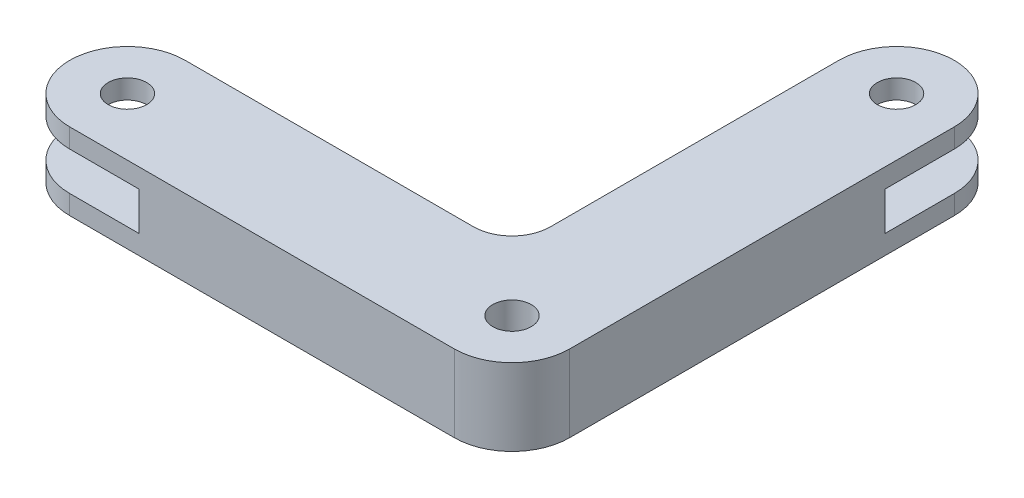
ISO-10303-21;
HEADER;
FILE_DESCRIPTION(('STEP AP214'),'2;1');
FILE_NAME('part.step','',(''),(''),'','','');
FILE_SCHEMA(('AUTOMOTIVE_DESIGN { 1 0 10303 214 1 1 1 1 }'));
ENDSEC;
DATA;
#1=APPLICATION_CONTEXT('core data for automotive mechanical design processes');
#2=APPLICATION_PROTOCOL_DEFINITION('international standard','automotive_design',2000,#1);
#3=PRODUCT_CONTEXT('',#1,'mechanical');
#4=PRODUCT('Part','Part','',(#3));
#5=PRODUCT_RELATED_PRODUCT_CATEGORY('part','',(#4));
#6=PRODUCT_DEFINITION_FORMATION('','',#4);
#7=PRODUCT_DEFINITION_CONTEXT('part definition',#1,'design');
#8=PRODUCT_DEFINITION('design','',#6,#7);
#9=PRODUCT_DEFINITION_SHAPE('','',#8);
#10=(LENGTH_UNIT() NAMED_UNIT(*) SI_UNIT(.MILLI.,.METRE.));
#11=(NAMED_UNIT(*) PLANE_ANGLE_UNIT() SI_UNIT($,.RADIAN.));
#12=(NAMED_UNIT(*) SI_UNIT($,.STERADIAN.) SOLID_ANGLE_UNIT());
#13=UNCERTAINTY_MEASURE_WITH_UNIT(LENGTH_MEASURE(1.E-05),#10,'distance_accuracy_value','');
#14=(GEOMETRIC_REPRESENTATION_CONTEXT(3) GLOBAL_UNCERTAINTY_ASSIGNED_CONTEXT((#13)) GLOBAL_UNIT_ASSIGNED_CONTEXT((#10,
#11,#12)) REPRESENTATION_CONTEXT('',''));
#15=CARTESIAN_POINT('',(0.,0.,0.));
#16=DIRECTION('',(0.,0.,1.));
#17=DIRECTION('',(1.,0.,0.));
#18=AXIS2_PLACEMENT_3D('',#15,#16,#17);
#19=CARTESIAN_POINT('',(-2.44892974052389,9.,-42.4489297405239));
#20=DIRECTION('',(0.,-1.,0.));
#21=DIRECTION('',(0.,0.,-1.));
#22=AXIS2_PLACEMENT_3D('',#19,#20,#21);
#23=CYLINDRICAL_SURFACE('',#22,6.);
#24=CARTESIAN_POINT('',(-2.44892974052389,3.,-42.4489297405239));
#25=DIRECTION('',(0.,1.,0.));
#26=DIRECTION('',(0.,0.,1.));
#27=AXIS2_PLACEMENT_3D('',#24,#25,#26);
#28=CIRCLE('',#27,6.);
#29=CARTESIAN_POINT('',(3.55107025947611,3.,-42.4489297405239));
#30=VERTEX_POINT('',#29);
#31=CARTESIAN_POINT('',(-8.44892974052389,3.,-42.4489297405239));
#32=VERTEX_POINT('',#31);
#33=EDGE_CURVE('E60',#30,#32,#28,.T.);
#34=ORIENTED_EDGE('',*,*,#33,.F.);
#35=DIRECTION('',(0.,-1.,0.));
#36=VECTOR('',#35,1.);
#37=CARTESIAN_POINT('',(3.55107025947611,9.,-42.4489297405239));
#38=LINE('',#37,#36);
#39=CARTESIAN_POINT('',(3.55107025947611,1.,-42.4489297405239));
#40=VERTEX_POINT('',#39);
#41=EDGE_CURVE('E289',#30,#40,#38,.T.);
#42=ORIENTED_EDGE('',*,*,#41,.T.);
#43=CARTESIAN_POINT('',(-2.44892974052389,1.,-42.4489297405239));
#44=DIRECTION('',(0.,1.,0.));
#45=DIRECTION('',(0.,0.,1.));
#46=AXIS2_PLACEMENT_3D('',#43,#44,#45);
#47=CIRCLE('',#46,6.);
#48=CARTESIAN_POINT('',(-8.44892974052389,1.,-42.4489297405239));
#49=VERTEX_POINT('',#48);
#50=EDGE_CURVE('E260',#40,#49,#47,.T.);
#51=ORIENTED_EDGE('',*,*,#50,.T.);
#52=DIRECTION('',(0.,-1.,0.));
#53=VECTOR('',#52,1.);
#54=CARTESIAN_POINT('',(-8.44892974052389,9.,-42.4489297405239));
#55=LINE('',#54,#53);
#56=EDGE_CURVE('E285',#32,#49,#55,.T.);
#57=ORIENTED_EDGE('',*,*,#56,.F.);
#58=EDGE_LOOP('',(#34,#42,#51,#57));
#59=FACE_BOUND('',#58,.T.);
#60=ADVANCED_FACE('F42',(#59),#23,.T.);
#61=CARTESIAN_POINT('',(-42.4489297405239,9.,-2.44892974052389));
#62=DIRECTION('',(0.,-1.,0.));
#63=DIRECTION('',(0.,0.,-1.));
#64=AXIS2_PLACEMENT_3D('',#61,#62,#63);
#65=CYLINDRICAL_SURFACE('',#64,6.);
#66=CARTESIAN_POINT('',(-42.4489297405239,3.,-2.44892974052389));
#67=DIRECTION('',(0.,1.,0.));
#68=DIRECTION('',(0.,0.,1.));
#69=AXIS2_PLACEMENT_3D('',#66,#67,#68);
#70=CIRCLE('',#69,6.);
#71=CARTESIAN_POINT('',(-42.4489297405239,3.,-8.44892974052389));
#72=VERTEX_POINT('',#71);
#73=CARTESIAN_POINT('',(-42.4489297405239,3.,3.55107025947611));
#74=VERTEX_POINT('',#73);
#75=EDGE_CURVE('E180',#72,#74,#70,.T.);
#76=ORIENTED_EDGE('',*,*,#75,.F.);
#77=DIRECTION('',(0.,-1.,0.));
#78=VECTOR('',#77,1.);
#79=CARTESIAN_POINT('',(-42.4489297405239,9.,-8.44892974052389));
#80=LINE('',#79,#78);
#81=CARTESIAN_POINT('',(-42.4489297405239,1.,-8.44892974052389));
#82=VERTEX_POINT('',#81);
#83=EDGE_CURVE('E246',#72,#82,#80,.T.);
#84=ORIENTED_EDGE('',*,*,#83,.T.);
#85=CARTESIAN_POINT('',(-42.4489297405239,1.,-2.44892974052389));
#86=DIRECTION('',(0.,1.,0.));
#87=DIRECTION('',(0.,0.,1.));
#88=AXIS2_PLACEMENT_3D('',#85,#86,#87);
#89=CIRCLE('',#88,6.);
#90=CARTESIAN_POINT('',(-42.4489297405239,1.,3.55107025947611));
#91=VERTEX_POINT('',#90);
#92=EDGE_CURVE('E219',#82,#91,#89,.T.);
#93=ORIENTED_EDGE('',*,*,#92,.T.);
#94=DIRECTION('',(0.,-1.,0.));
#95=VECTOR('',#94,1.);
#96=CARTESIAN_POINT('',(-42.4489297405239,9.,3.55107025947611));
#97=LINE('',#96,#95);
#98=EDGE_CURVE('E52',#74,#91,#97,.T.);
#99=ORIENTED_EDGE('',*,*,#98,.F.);
#100=EDGE_LOOP('',(#76,#84,#93,#99));
#101=FACE_BOUND('',#100,.T.);
#102=ADVANCED_FACE('F389',(#101),#65,.T.);
#103=CARTESIAN_POINT('',(-42.4489297405239,9.,-2.44892974052389));
#104=DIRECTION('',(0.,1.,0.));
#105=DIRECTION('',(0.,0.,1.));
#106=AXIS2_PLACEMENT_3D('',#103,#104,#105);
#107=PLANE('',#106);
#108=CARTESIAN_POINT('',(-2.44892974052389,9.,-42.4489297405239));
#109=DIRECTION('',(0.,1.,0.));
#110=DIRECTION('',(0.,0.,1.));
#111=AXIS2_PLACEMENT_3D('',#108,#109,#110);
#112=CIRCLE('',#111,2.);
#113=CARTESIAN_POINT('',(-2.44892974052389,9.,-40.4489297405239));
#114=VERTEX_POINT('',#113);
#115=EDGE_CURVE('E313',#114,#114,#112,.T.);
#116=ORIENTED_EDGE('',*,*,#115,.F.);
#117=EDGE_LOOP('',(#116));
#118=FACE_BOUND('',#117,.T.);
#119=CARTESIAN_POINT('',(-2.44892974052389,9.,-2.44892974052389));
#120=DIRECTION('',(0.,1.,0.));
#121=DIRECTION('',(0.,0.,1.));
#122=AXIS2_PLACEMENT_3D('',#119,#120,#121);
#123=CIRCLE('',#122,2.);
#124=CARTESIAN_POINT('',(-2.44892974052389,9.,-0.448929740523893));
#125=VERTEX_POINT('',#124);
#126=EDGE_CURVE('E319',#125,#125,#123,.T.);
#127=ORIENTED_EDGE('',*,*,#126,.F.);
#128=EDGE_LOOP('',(#127));
#129=FACE_BOUND('',#128,.T.);
#130=CARTESIAN_POINT('',(-42.4489297405239,9.,-2.44892974052389));
#131=DIRECTION('',(0.,1.,0.));
#132=DIRECTION('',(0.,0.,1.));
#133=AXIS2_PLACEMENT_3D('',#130,#131,#132);
#134=CIRCLE('',#133,2.);
#135=CARTESIAN_POINT('',(-42.4489297405239,9.,-0.44892974052389));
#136=VERTEX_POINT('',#135);
#137=EDGE_CURVE('E329',#136,#136,#134,.T.);
#138=ORIENTED_EDGE('',*,*,#137,.F.);
#139=EDGE_LOOP('',(#138));
#140=FACE_BOUND('',#139,.T.);
#141=CARTESIAN_POINT('',(-42.4489297405239,9.,-2.44892974052389));
#142=DIRECTION('',(0.,1.,0.));
#143=DIRECTION('',(0.,0.,1.));
#144=AXIS2_PLACEMENT_3D('',#141,#142,#143);
#145=CIRCLE('',#144,6.);
#146=CARTESIAN_POINT('',(-42.4489297405239,9.,-8.44892974052389));
#147=VERTEX_POINT('',#146);
#148=CARTESIAN_POINT('',(-42.4489297405239,9.,3.55107025947611));
#149=VERTEX_POINT('',#148);
#150=EDGE_CURVE('E220',#147,#149,#145,.T.);
#151=ORIENTED_EDGE('',*,*,#150,.T.);
#152=DIRECTION('',(1.,0.,0.));
#153=VECTOR('',#152,1.);
#154=CARTESIAN_POINT('',(-42.4489297405239,9.,3.55107025947611));
#155=LINE('',#154,#153);
#156=CARTESIAN_POINT('',(-2.44892974052389,9.,3.55107025947611));
#157=VERTEX_POINT('',#156);
#158=EDGE_CURVE('E224',#149,#157,#155,.T.);
#159=ORIENTED_EDGE('',*,*,#158,.T.);
#160=CARTESIAN_POINT('',(-2.44892974052389,9.,-2.44892974052389));
#161=DIRECTION('',(0.,1.,0.));
#162=DIRECTION('',(0.,0.,1.));
#163=AXIS2_PLACEMENT_3D('',#160,#161,#162);
#164=CIRCLE('',#163,6.);
#165=CARTESIAN_POINT('',(3.55107025947611,9.,-2.44892974052389));
#166=VERTEX_POINT('',#165);
#167=EDGE_CURVE('E228',#157,#166,#164,.T.);
#168=ORIENTED_EDGE('',*,*,#167,.T.);
#169=DIRECTION('',(0.,0.,-1.));
#170=VECTOR('',#169,1.);
#171=CARTESIAN_POINT('',(3.55107025947611,9.,-42.4489297405239));
#172=LINE('',#171,#170);
#173=CARTESIAN_POINT('',(3.55107025947611,9.,-42.4489297405239));
#174=VERTEX_POINT('',#173);
#175=EDGE_CURVE('E231',#166,#174,#172,.T.);
#176=ORIENTED_EDGE('',*,*,#175,.T.);
#177=CARTESIAN_POINT('',(-2.44892974052389,9.,-42.4489297405239));
#178=DIRECTION('',(0.,1.,0.));
#179=DIRECTION('',(0.,0.,1.));
#180=AXIS2_PLACEMENT_3D('',#177,#178,#179);
#181=CIRCLE('',#180,6.);
#182=CARTESIAN_POINT('',(-8.44892974052389,9.,-42.4489297405239));
#183=VERTEX_POINT('',#182);
#184=EDGE_CURVE('E234',#174,#183,#181,.T.);
#185=ORIENTED_EDGE('',*,*,#184,.T.);
#186=DIRECTION('',(0.,0.,1.));
#187=VECTOR('',#186,1.);
#188=CARTESIAN_POINT('',(-8.44892974052389,9.,-42.4489297405239));
#189=LINE('',#188,#187);
#190=CARTESIAN_POINT('',(-8.44892974052389,9.,-12.4489297405239));
#191=VERTEX_POINT('',#190);
#192=EDGE_CURVE('E237',#183,#191,#189,.T.);
#193=ORIENTED_EDGE('',*,*,#192,.T.);
#194=CARTESIAN_POINT('',(-12.4489297405239,9.,-12.4489297405239));
#195=DIRECTION('',(0.,-1.,0.));
#196=DIRECTION('',(0.,0.,1.));
#197=AXIS2_PLACEMENT_3D('',#194,#195,#196);
#198=CIRCLE('',#197,4.);
#199=CARTESIAN_POINT('',(-12.4489297405239,9.,-8.44892974052389));
#200=VERTEX_POINT('',#199);
#201=EDGE_CURVE('E240',#191,#200,#198,.T.);
#202=ORIENTED_EDGE('',*,*,#201,.T.);
#203=DIRECTION('',(-1.,0.,0.));
#204=VECTOR('',#203,1.);
#205=CARTESIAN_POINT('',(-42.4489297405239,9.,-8.44892974052389));
#206=LINE('',#205,#204);
#207=EDGE_CURVE('E243',#200,#147,#206,.T.);
#208=ORIENTED_EDGE('',*,*,#207,.T.);
#209=EDGE_LOOP('',(#151,#159,#168,#176,#185,#193,#202,#208));
#210=FACE_BOUND('',#209,.T.);
#211=ADVANCED_FACE('F367',(#118,#129,#140,#210),#107,.T.);
#212=CARTESIAN_POINT('',(-42.4489297405239,1.,-2.44892974052389));
#213=DIRECTION('',(0.,1.,0.));
#214=DIRECTION('',(0.,0.,1.));
#215=AXIS2_PLACEMENT_3D('',#212,#213,#214);
#216=PLANE('',#215);
#217=CARTESIAN_POINT('',(-2.44892974052389,0.999999999999999,-42.4489297405239));
#218=DIRECTION('',(0.,1.,0.));
#219=DIRECTION('',(0.,0.,1.));
#220=AXIS2_PLACEMENT_3D('',#217,#218,#219);
#221=CIRCLE('',#220,2.);
#222=CARTESIAN_POINT('',(-2.44892974052389,0.999999999999999,-40.4489297405239));
#223=VERTEX_POINT('',#222);
#224=EDGE_CURVE('E305',#223,#223,#221,.T.);
#225=ORIENTED_EDGE('',*,*,#224,.T.);
#226=EDGE_LOOP('',(#225));
#227=FACE_BOUND('',#226,.T.);
#228=CARTESIAN_POINT('',(-2.44892974052389,0.999999999999999,-2.44892974052389));
#229=DIRECTION('',(0.,1.,0.));
#230=DIRECTION('',(0.,0.,1.));
#231=AXIS2_PLACEMENT_3D('',#228,#229,#230);
#232=CIRCLE('',#231,2.);
#233=CARTESIAN_POINT('',(-2.44892974052389,0.999999999999999,-0.448929740523893));
#234=VERTEX_POINT('',#233);
#235=EDGE_CURVE('E325',#234,#234,#232,.T.);
#236=ORIENTED_EDGE('',*,*,#235,.T.);
#237=EDGE_LOOP('',(#236));
#238=FACE_BOUND('',#237,.T.);
#239=CARTESIAN_POINT('',(-42.4489297405239,0.999999999999999,-2.44892974052389));
#240=DIRECTION('',(0.,1.,0.));
#241=DIRECTION('',(0.,0.,1.));
#242=AXIS2_PLACEMENT_3D('',#239,#240,#241);
#243=CIRCLE('',#242,2.);
#244=CARTESIAN_POINT('',(-42.4489297405239,0.999999999999999,-0.44892974052389));
#245=VERTEX_POINT('',#244);
#246=EDGE_CURVE('E333',#245,#245,#243,.T.);
#247=ORIENTED_EDGE('',*,*,#246,.T.);
#248=EDGE_LOOP('',(#247));
#249=FACE_BOUND('',#248,.T.);
#250=ORIENTED_EDGE('',*,*,#92,.F.);
#251=DIRECTION('',(-1.,0.,0.));
#252=VECTOR('',#251,1.);
#253=CARTESIAN_POINT('',(-42.4489297405239,1.,-8.44892974052389));
#254=LINE('',#253,#252);
#255=CARTESIAN_POINT('',(-12.4489297405239,1.,-8.44892974052389));
#256=VERTEX_POINT('',#255);
#257=EDGE_CURVE('E225',#256,#82,#254,.T.);
#258=ORIENTED_EDGE('',*,*,#257,.F.);
#259=CARTESIAN_POINT('',(-12.4489297405239,1.,-12.4489297405239));
#260=DIRECTION('',(0.,-1.,0.));
#261=DIRECTION('',(0.,0.,1.));
#262=AXIS2_PLACEMENT_3D('',#259,#260,#261);
#263=CIRCLE('',#262,4.);
#264=CARTESIAN_POINT('',(-8.44892974052389,1.,-12.4489297405239));
#265=VERTEX_POINT('',#264);
#266=EDGE_CURVE('E267',#265,#256,#263,.T.);
#267=ORIENTED_EDGE('',*,*,#266,.F.);
#268=DIRECTION('',(0.,0.,1.));
#269=VECTOR('',#268,1.);
#270=CARTESIAN_POINT('',(-8.44892974052389,1.,-42.4489297405239));
#271=LINE('',#270,#269);
#272=EDGE_CURVE('E264',#49,#265,#271,.T.);
#273=ORIENTED_EDGE('',*,*,#272,.F.);
#274=ORIENTED_EDGE('',*,*,#50,.F.);
#275=DIRECTION('',(0.,0.,-1.));
#276=VECTOR('',#275,1.);
#277=CARTESIAN_POINT('',(3.55107025947611,1.,-42.4489297405239));
#278=LINE('',#277,#276);
#279=CARTESIAN_POINT('',(3.55107025947611,1.,-2.44892974052389));
#280=VERTEX_POINT('',#279);
#281=EDGE_CURVE('E256',#280,#40,#278,.T.);
#282=ORIENTED_EDGE('',*,*,#281,.F.);
#283=CARTESIAN_POINT('',(-2.44892974052389,1.,-2.44892974052389));
#284=DIRECTION('',(0.,1.,0.));
#285=DIRECTION('',(0.,0.,1.));
#286=AXIS2_PLACEMENT_3D('',#283,#284,#285);
#287=CIRCLE('',#286,6.);
#288=CARTESIAN_POINT('',(-2.44892974052389,1.,3.55107025947611));
#289=VERTEX_POINT('',#288);
#290=EDGE_CURVE('E253',#289,#280,#287,.T.);
#291=ORIENTED_EDGE('',*,*,#290,.F.);
#292=DIRECTION('',(1.,0.,0.));
#293=VECTOR('',#292,1.);
#294=CARTESIAN_POINT('',(-42.4489297405239,1.,3.55107025947611));
#295=LINE('',#294,#293);
#296=EDGE_CURVE('E250',#91,#289,#295,.T.);
#297=ORIENTED_EDGE('',*,*,#296,.F.);
#298=EDGE_LOOP('',(#250,#258,#267,#273,#274,#282,#291,#297));
#299=FACE_BOUND('',#298,.T.);
#300=ADVANCED_FACE('F378',(#227,#238,#249,#299),#216,.F.);
#301=CARTESIAN_POINT('',(-42.4489297405239,7.,-8.44892974052389));
#302=VERTEX_POINT('',#301);
#303=EDGE_CURVE('E273',#147,#302,#80,.T.);
#304=ORIENTED_EDGE('',*,*,#303,.T.);
#305=CARTESIAN_POINT('',(-42.4489297405239,7.,-2.44892974052389));
#306=DIRECTION('',(0.,1.,0.));
#307=DIRECTION('',(0.,0.,1.));
#308=AXIS2_PLACEMENT_3D('',#305,#306,#307);
#309=CIRCLE('',#308,6.);
#310=CARTESIAN_POINT('',(-42.4489297405239,7.,3.55107025947611));
#311=VERTEX_POINT('',#310);
#312=EDGE_CURVE('E197',#302,#311,#309,.T.);
#313=ORIENTED_EDGE('',*,*,#312,.T.);
#314=EDGE_CURVE('E11',#149,#311,#97,.T.);
#315=ORIENTED_EDGE('',*,*,#314,.F.);
#316=ORIENTED_EDGE('',*,*,#150,.F.);
#317=EDGE_LOOP('',(#304,#313,#315,#316));
#318=FACE_BOUND('',#317,.T.);
#319=ADVANCED_FACE('F44',(#318),#65,.T.);
#320=CARTESIAN_POINT('',(-42.4489297405239,9.,3.55107025947611));
#321=DIRECTION('',(0.,0.,-1.));
#322=DIRECTION('',(-1.,0.,0.));
#323=AXIS2_PLACEMENT_3D('',#320,#321,#322);
#324=PLANE('',#323);
#325=ORIENTED_EDGE('',*,*,#314,.T.);
#326=DIRECTION('',(1.,0.,0.));
#327=VECTOR('',#326,1.);
#328=CARTESIAN_POINT('',(-42.4489297405239,7.,3.55107025947611));
#329=LINE('',#328,#327);
#330=CARTESIAN_POINT('',(-35.2489297405239,7.,3.55107025947611));
#331=VERTEX_POINT('',#330);
#332=EDGE_CURVE('E201',#311,#331,#329,.T.);
#333=ORIENTED_EDGE('',*,*,#332,.T.);
#334=DIRECTION('',(0.,-1.,0.));
#335=VECTOR('',#334,1.);
#336=CARTESIAN_POINT('',(-35.2489297405239,7.,3.55107025947611));
#337=LINE('',#336,#335);
#338=CARTESIAN_POINT('',(-35.2489297405239,3.,3.55107025947611));
#339=VERTEX_POINT('',#338);
#340=EDGE_CURVE('E215',#331,#339,#337,.T.);
#341=ORIENTED_EDGE('',*,*,#340,.T.);
#342=DIRECTION('',(1.,0.,0.));
#343=VECTOR('',#342,1.);
#344=CARTESIAN_POINT('',(-42.4489297405239,3.,3.55107025947611));
#345=LINE('',#344,#343);
#346=EDGE_CURVE('E184',#74,#339,#345,.T.);
#347=ORIENTED_EDGE('',*,*,#346,.F.);
#348=ORIENTED_EDGE('',*,*,#98,.T.);
#349=ORIENTED_EDGE('',*,*,#296,.T.);
#350=DIRECTION('',(0.,-1.,0.));
#351=VECTOR('',#350,1.);
#352=CARTESIAN_POINT('',(-2.44892974052389,9.,3.55107025947611));
#353=LINE('',#352,#351);
#354=EDGE_CURVE('E298',#157,#289,#353,.T.);
#355=ORIENTED_EDGE('',*,*,#354,.F.);
#356=ORIENTED_EDGE('',*,*,#158,.F.);
#357=EDGE_LOOP('',(#325,#333,#341,#347,#348,#349,#355,#356));
#358=FACE_BOUND('',#357,.T.);
#359=ADVANCED_FACE('F400',(#358),#324,.F.);
#360=CARTESIAN_POINT('',(-2.44892974052389,9.,-2.44892974052389));
#361=DIRECTION('',(0.,-1.,0.));
#362=DIRECTION('',(0.,0.,-1.));
#363=AXIS2_PLACEMENT_3D('',#360,#361,#362);
#364=CYLINDRICAL_SURFACE('',#363,6.);
#365=ORIENTED_EDGE('',*,*,#290,.T.);
#366=DIRECTION('',(0.,-1.,0.));
#367=VECTOR('',#366,1.);
#368=CARTESIAN_POINT('',(3.55107025947611,9.,-2.44892974052389));
#369=LINE('',#368,#367);
#370=EDGE_CURVE('E294',#166,#280,#369,.T.);
#371=ORIENTED_EDGE('',*,*,#370,.F.);
#372=ORIENTED_EDGE('',*,*,#167,.F.);
#373=ORIENTED_EDGE('',*,*,#354,.T.);
#374=EDGE_LOOP('',(#365,#371,#372,#373));
#375=FACE_BOUND('',#374,.T.);
#376=ADVANCED_FACE('F402',(#375),#364,.T.);
#377=CARTESIAN_POINT('',(3.55107025947611,9.,-42.4489297405239));
#378=DIRECTION('',(-1.,0.,0.));
#379=DIRECTION('',(0.,0.,1.));
#380=AXIS2_PLACEMENT_3D('',#377,#378,#379);
#381=PLANE('',#380);
#382=DIRECTION('',(0.,-1.,0.));
#383=VECTOR('',#382,1.);
#384=CARTESIAN_POINT('',(3.55107025947611,7.,-35.2489297405239));
#385=LINE('',#384,#383);
#386=CARTESIAN_POINT('',(3.55107025947611,7.,-35.2489297405239));
#387=VERTEX_POINT('',#386);
#388=CARTESIAN_POINT('',(3.55107025947611,3.,-35.2489297405239));
#389=VERTEX_POINT('',#388);
#390=EDGE_CURVE('E164',#387,#389,#385,.T.);
#391=ORIENTED_EDGE('',*,*,#390,.F.);
#392=DIRECTION('',(0.,0.,-1.));
#393=VECTOR('',#392,1.);
#394=CARTESIAN_POINT('',(3.55107025947611,7.,-42.4489297405239));
#395=LINE('',#394,#393);
#396=CARTESIAN_POINT('',(3.55107025947611,7.,-42.4489297405239));
#397=VERTEX_POINT('',#396);
#398=EDGE_CURVE('E186',#387,#397,#395,.T.);
#399=ORIENTED_EDGE('',*,*,#398,.T.);
#400=EDGE_CURVE('E290',#174,#397,#38,.T.);
#401=ORIENTED_EDGE('',*,*,#400,.F.);
#402=ORIENTED_EDGE('',*,*,#175,.F.);
#403=ORIENTED_EDGE('',*,*,#370,.T.);
#404=ORIENTED_EDGE('',*,*,#281,.T.);
#405=ORIENTED_EDGE('',*,*,#41,.F.);
#406=DIRECTION('',(0.,0.,-1.));
#407=VECTOR('',#406,1.);
#408=CARTESIAN_POINT('',(3.55107025947611,3.,-42.4489297405239));
#409=LINE('',#408,#407);
#410=EDGE_CURVE('E167',#389,#30,#409,.T.);
#411=ORIENTED_EDGE('',*,*,#410,.F.);
#412=EDGE_LOOP('',(#391,#399,#401,#402,#403,#404,#405,#411));
#413=FACE_BOUND('',#412,.T.);
#414=ADVANCED_FACE('F358',(#413),#381,.F.);
#415=ORIENTED_EDGE('',*,*,#400,.T.);
#416=CARTESIAN_POINT('',(-2.44892974052389,7.,-42.4489297405239));
#417=DIRECTION('',(0.,1.,0.));
#418=DIRECTION('',(0.,0.,1.));
#419=AXIS2_PLACEMENT_3D('',#416,#417,#418);
#420=CIRCLE('',#419,6.);
#421=CARTESIAN_POINT('',(-8.44892974052389,7.,-42.4489297405239));
#422=VERTEX_POINT('',#421);
#423=EDGE_CURVE('E345',#397,#422,#420,.T.);
#424=ORIENTED_EDGE('',*,*,#423,.T.);
#425=EDGE_CURVE('E286',#183,#422,#55,.T.);
#426=ORIENTED_EDGE('',*,*,#425,.F.);
#427=ORIENTED_EDGE('',*,*,#184,.F.);
#428=EDGE_LOOP('',(#415,#424,#426,#427));
#429=FACE_BOUND('',#428,.T.);
#430=ADVANCED_FACE('F363',(#429),#23,.T.);
#431=CARTESIAN_POINT('',(-8.44892974052389,9.,-42.4489297405239));
#432=DIRECTION('',(1.,0.,0.));
#433=DIRECTION('',(0.,0.,-1.));
#434=AXIS2_PLACEMENT_3D('',#431,#432,#433);
#435=PLANE('',#434);
#436=ORIENTED_EDGE('',*,*,#425,.T.);
#437=DIRECTION('',(0.,0.,1.));
#438=VECTOR('',#437,1.);
#439=CARTESIAN_POINT('',(-8.44892974052389,7.,-42.4489297405239));
#440=LINE('',#439,#438);
#441=CARTESIAN_POINT('',(-8.44892974052389,7.,-35.2489297405239));
#442=VERTEX_POINT('',#441);
#443=EDGE_CURVE('E178',#422,#442,#440,.T.);
#444=ORIENTED_EDGE('',*,*,#443,.T.);
#445=DIRECTION('',(0.,-1.,0.));
#446=VECTOR('',#445,1.);
#447=CARTESIAN_POINT('',(-8.44892974052389,7.,-35.2489297405239));
#448=LINE('',#447,#446);
#449=CARTESIAN_POINT('',(-8.44892974052389,3.,-35.2489297405239));
#450=VERTEX_POINT('',#449);
#451=EDGE_CURVE('E161',#442,#450,#448,.T.);
#452=ORIENTED_EDGE('',*,*,#451,.T.);
#453=DIRECTION('',(0.,0.,1.));
#454=VECTOR('',#453,1.);
#455=CARTESIAN_POINT('',(-8.44892974052389,3.,-42.4489297405239));
#456=LINE('',#455,#454);
#457=EDGE_CURVE('E168',#32,#450,#456,.T.);
#458=ORIENTED_EDGE('',*,*,#457,.F.);
#459=ORIENTED_EDGE('',*,*,#56,.T.);
#460=ORIENTED_EDGE('',*,*,#272,.T.);
#461=DIRECTION('',(0.,-1.,0.));
#462=VECTOR('',#461,1.);
#463=CARTESIAN_POINT('',(-8.44892974052389,9.,-12.4489297405239));
#464=LINE('',#463,#462);
#465=EDGE_CURVE('E281',#191,#265,#464,.T.);
#466=ORIENTED_EDGE('',*,*,#465,.F.);
#467=ORIENTED_EDGE('',*,*,#192,.F.);
#468=EDGE_LOOP('',(#436,#444,#452,#458,#459,#460,#466,#467));
#469=FACE_BOUND('',#468,.T.);
#470=ADVANCED_FACE('F177',(#469),#435,.F.);
#471=CARTESIAN_POINT('',(-12.4489297405239,9.,-12.4489297405239));
#472=DIRECTION('',(0.,-1.,0.));
#473=DIRECTION('',(0.,0.,-1.));
#474=AXIS2_PLACEMENT_3D('',#471,#472,#473);
#475=CYLINDRICAL_SURFACE('',#474,4.);
#476=ORIENTED_EDGE('',*,*,#266,.T.);
#477=DIRECTION('',(0.,-1.,0.));
#478=VECTOR('',#477,1.);
#479=CARTESIAN_POINT('',(-12.4489297405239,9.,-8.44892974052389));
#480=LINE('',#479,#478);
#481=EDGE_CURVE('E277',#200,#256,#480,.T.);
#482=ORIENTED_EDGE('',*,*,#481,.F.);
#483=ORIENTED_EDGE('',*,*,#201,.F.);
#484=ORIENTED_EDGE('',*,*,#465,.T.);
#485=EDGE_LOOP('',(#476,#482,#483,#484));
#486=FACE_BOUND('',#485,.T.);
#487=ADVANCED_FACE('F420',(#486),#475,.F.);
#488=CARTESIAN_POINT('',(-42.4489297405239,9.,-8.44892974052389));
#489=DIRECTION('',(0.,0.,1.));
#490=DIRECTION('',(1.,0.,0.));
#491=AXIS2_PLACEMENT_3D('',#488,#489,#490);
#492=PLANE('',#491);
#493=DIRECTION('',(0.,-1.,0.));
#494=VECTOR('',#493,1.);
#495=CARTESIAN_POINT('',(-35.2489297405239,7.,-8.44892974052389));
#496=LINE('',#495,#494);
#497=CARTESIAN_POINT('',(-35.2489297405239,7.,-8.44892974052389));
#498=VERTEX_POINT('',#497);
#499=CARTESIAN_POINT('',(-35.2489297405239,3.,-8.44892974052389));
#500=VERTEX_POINT('',#499);
#501=EDGE_CURVE('E212',#498,#500,#496,.T.);
#502=ORIENTED_EDGE('',*,*,#501,.F.);
#503=DIRECTION('',(-1.,0.,0.));
#504=VECTOR('',#503,1.);
#505=CARTESIAN_POINT('',(-42.4489297405239,7.,-8.44892974052389));
#506=LINE('',#505,#504);
#507=EDGE_CURVE('E208',#498,#302,#506,.T.);
#508=ORIENTED_EDGE('',*,*,#507,.T.);
#509=ORIENTED_EDGE('',*,*,#303,.F.);
#510=ORIENTED_EDGE('',*,*,#207,.F.);
#511=ORIENTED_EDGE('',*,*,#481,.T.);
#512=ORIENTED_EDGE('',*,*,#257,.T.);
#513=ORIENTED_EDGE('',*,*,#83,.F.);
#514=DIRECTION('',(-1.,0.,0.));
#515=VECTOR('',#514,1.);
#516=CARTESIAN_POINT('',(-42.4489297405239,3.,-8.44892974052389));
#517=LINE('',#516,#515);
#518=EDGE_CURVE('E194',#500,#72,#517,.T.);
#519=ORIENTED_EDGE('',*,*,#518,.F.);
#520=EDGE_LOOP('',(#502,#508,#509,#510,#511,#512,#513,#519));
#521=FACE_BOUND('',#520,.T.);
#522=ADVANCED_FACE('F395',(#521),#492,.F.);
#523=CARTESIAN_POINT('',(-42.4489297405239,7.,-2.44892974052389));
#524=DIRECTION('',(0.,1.,0.));
#525=DIRECTION('',(0.,0.,1.));
#526=AXIS2_PLACEMENT_3D('',#523,#524,#525);
#527=PLANE('',#526);
#528=CARTESIAN_POINT('',(-42.4489297405239,7.,-2.44892974052389));
#529=DIRECTION('',(0.,1.,0.));
#530=DIRECTION('',(0.,0.,1.));
#531=AXIS2_PLACEMENT_3D('',#528,#529,#530);
#532=CIRCLE('',#531,2.);
#533=CARTESIAN_POINT('',(-42.4489297405239,7.,-0.44892974052389));
#534=VERTEX_POINT('',#533);
#535=EDGE_CURVE('E337',#534,#534,#532,.T.);
#536=ORIENTED_EDGE('',*,*,#535,.T.);
#537=EDGE_LOOP('',(#536));
#538=FACE_BOUND('',#537,.T.);
#539=ORIENTED_EDGE('',*,*,#312,.F.);
#540=ORIENTED_EDGE('',*,*,#507,.F.);
#541=DIRECTION('',(0.,0.,-1.));
#542=VECTOR('',#541,1.);
#543=CARTESIAN_POINT('',(-35.2489297405239,7.,-8.44892974052389));
#544=LINE('',#543,#542);
#545=EDGE_CURVE('E205',#331,#498,#544,.T.);
#546=ORIENTED_EDGE('',*,*,#545,.F.);
#547=ORIENTED_EDGE('',*,*,#332,.F.);
#548=EDGE_LOOP('',(#539,#540,#546,#547));
#549=FACE_BOUND('',#548,.T.);
#550=ADVANCED_FACE('F429',(#538,#549),#527,.F.);
#551=CARTESIAN_POINT('',(-35.2489297405239,7.,-8.44892974052389));
#552=DIRECTION('',(-1.,0.,0.));
#553=DIRECTION('',(0.,0.,1.));
#554=AXIS2_PLACEMENT_3D('',#551,#552,#553);
#555=PLANE('',#554);
#556=ORIENTED_EDGE('',*,*,#340,.F.);
#557=ORIENTED_EDGE('',*,*,#545,.T.);
#558=ORIENTED_EDGE('',*,*,#501,.T.);
#559=DIRECTION('',(0.,0.,-1.));
#560=VECTOR('',#559,1.);
#561=CARTESIAN_POINT('',(-35.2489297405239,3.,-8.44892974052389));
#562=LINE('',#561,#560);
#563=EDGE_CURVE('E68',#339,#500,#562,.T.);
#564=ORIENTED_EDGE('',*,*,#563,.F.);
#565=EDGE_LOOP('',(#556,#557,#558,#564));
#566=FACE_BOUND('',#565,.T.);
#567=ADVANCED_FACE('F435',(#566),#555,.T.);
#568=CARTESIAN_POINT('',(-42.4489297405239,3.,-2.44892974052389));
#569=DIRECTION('',(0.,1.,0.));
#570=DIRECTION('',(0.,0.,1.));
#571=AXIS2_PLACEMENT_3D('',#568,#569,#570);
#572=PLANE('',#571);
#573=CARTESIAN_POINT('',(-42.4489297405239,3.,-2.44892974052389));
#574=DIRECTION('',(0.,1.,0.));
#575=DIRECTION('',(0.,0.,1.));
#576=AXIS2_PLACEMENT_3D('',#573,#574,#575);
#577=CIRCLE('',#576,2.);
#578=CARTESIAN_POINT('',(-42.4489297405239,3.,-0.44892974052389));
#579=VERTEX_POINT('',#578);
#580=EDGE_CURVE('E46',#579,#579,#577,.T.);
#581=ORIENTED_EDGE('',*,*,#580,.F.);
#582=EDGE_LOOP('',(#581));
#583=FACE_BOUND('',#582,.T.);
#584=ORIENTED_EDGE('',*,*,#75,.T.);
#585=ORIENTED_EDGE('',*,*,#346,.T.);
#586=ORIENTED_EDGE('',*,*,#563,.T.);
#587=ORIENTED_EDGE('',*,*,#518,.T.);
#588=EDGE_LOOP('',(#584,#585,#586,#587));
#589=FACE_BOUND('',#588,.T.);
#590=ADVANCED_FACE('F438',(#583,#589),#572,.T.);
#591=CARTESIAN_POINT('',(-2.44892974052389,7.,-42.4489297405239));
#592=DIRECTION('',(0.,1.,0.));
#593=DIRECTION('',(0.,0.,1.));
#594=AXIS2_PLACEMENT_3D('',#591,#592,#593);
#595=PLANE('',#594);
#596=CARTESIAN_POINT('',(-2.44892974052389,7.,-42.4489297405239));
#597=DIRECTION('',(0.,1.,0.));
#598=DIRECTION('',(0.,0.,1.));
#599=AXIS2_PLACEMENT_3D('',#596,#597,#598);
#600=CIRCLE('',#599,2.);
#601=CARTESIAN_POINT('',(-2.44892974052389,7.,-40.4489297405239));
#602=VERTEX_POINT('',#601);
#603=EDGE_CURVE('E304',#602,#602,#600,.T.);
#604=ORIENTED_EDGE('',*,*,#603,.T.);
#605=EDGE_LOOP('',(#604));
#606=FACE_BOUND('',#605,.T.);
#607=ORIENTED_EDGE('',*,*,#423,.F.);
#608=ORIENTED_EDGE('',*,*,#398,.F.);
#609=DIRECTION('',(1.,0.,0.));
#610=VECTOR('',#609,1.);
#611=CARTESIAN_POINT('',(-8.44892974052389,7.,-35.2489297405239));
#612=LINE('',#611,#610);
#613=EDGE_CURVE('E351',#442,#387,#612,.T.);
#614=ORIENTED_EDGE('',*,*,#613,.F.);
#615=ORIENTED_EDGE('',*,*,#443,.F.);
#616=EDGE_LOOP('',(#607,#608,#614,#615));
#617=FACE_BOUND('',#616,.T.);
#618=ADVANCED_FACE('F445',(#606,#617),#595,.F.);
#619=CARTESIAN_POINT('',(-8.44892974052389,7.,-35.2489297405239));
#620=DIRECTION('',(0.,0.,-1.));
#621=DIRECTION('',(-1.,0.,0.));
#622=AXIS2_PLACEMENT_3D('',#619,#620,#621);
#623=PLANE('',#622);
#624=ORIENTED_EDGE('',*,*,#451,.F.);
#625=ORIENTED_EDGE('',*,*,#613,.T.);
#626=ORIENTED_EDGE('',*,*,#390,.T.);
#627=DIRECTION('',(1.,0.,0.));
#628=VECTOR('',#627,1.);
#629=CARTESIAN_POINT('',(-8.44892974052389,3.,-35.2489297405239));
#630=LINE('',#629,#628);
#631=EDGE_CURVE('E158',#450,#389,#630,.T.);
#632=ORIENTED_EDGE('',*,*,#631,.F.);
#633=EDGE_LOOP('',(#624,#625,#626,#632));
#634=FACE_BOUND('',#633,.T.);
#635=ADVANCED_FACE('F159',(#634),#623,.T.);
#636=CARTESIAN_POINT('',(-2.44892974052389,3.,-42.4489297405239));
#637=DIRECTION('',(0.,1.,0.));
#638=DIRECTION('',(0.,0.,1.));
#639=AXIS2_PLACEMENT_3D('',#636,#637,#638);
#640=PLANE('',#639);
#641=CARTESIAN_POINT('',(-2.44892974052389,3.,-42.4489297405239));
#642=DIRECTION('',(0.,1.,0.));
#643=DIRECTION('',(0.,0.,1.));
#644=AXIS2_PLACEMENT_3D('',#641,#642,#643);
#645=CIRCLE('',#644,2.);
#646=CARTESIAN_POINT('',(-2.44892974052389,3.,-40.4489297405239));
#647=VERTEX_POINT('',#646);
#648=EDGE_CURVE('E301',#647,#647,#645,.T.);
#649=ORIENTED_EDGE('',*,*,#648,.F.);
#650=EDGE_LOOP('',(#649));
#651=FACE_BOUND('',#650,.T.);
#652=ORIENTED_EDGE('',*,*,#33,.T.);
#653=ORIENTED_EDGE('',*,*,#457,.T.);
#654=ORIENTED_EDGE('',*,*,#631,.T.);
#655=ORIENTED_EDGE('',*,*,#410,.T.);
#656=EDGE_LOOP('',(#652,#653,#654,#655));
#657=FACE_BOUND('',#656,.T.);
#658=ADVANCED_FACE('F170',(#651,#657),#640,.T.);
#659=CARTESIAN_POINT('',(-2.44892974052389,0.999999999999999,-42.4489297405239));
#660=DIRECTION('',(0.,1.,0.));
#661=DIRECTION('',(0.,0.,1.));
#662=AXIS2_PLACEMENT_3D('',#659,#660,#661);
#663=CYLINDRICAL_SURFACE('',#662,2.);
#664=ORIENTED_EDGE('',*,*,#648,.T.);
#665=EDGE_LOOP('',(#664));
#666=FACE_BOUND('',#665,.T.);
#667=ORIENTED_EDGE('',*,*,#224,.F.);
#668=EDGE_LOOP('',(#667));
#669=FACE_BOUND('',#668,.T.);
#670=ADVANCED_FACE('F454',(#666,#669),#663,.F.);
#671=ORIENTED_EDGE('',*,*,#115,.T.);
#672=EDGE_LOOP('',(#671));
#673=FACE_BOUND('',#672,.T.);
#674=ORIENTED_EDGE('',*,*,#603,.F.);
#675=EDGE_LOOP('',(#674));
#676=FACE_BOUND('',#675,.T.);
#677=ADVANCED_FACE('F460',(#673,#676),#663,.F.);
#678=CARTESIAN_POINT('',(-42.4489297405239,0.999999999999999,-2.44892974052389));
#679=DIRECTION('',(0.,1.,0.));
#680=DIRECTION('',(0.,0.,1.));
#681=AXIS2_PLACEMENT_3D('',#678,#679,#680);
#682=CYLINDRICAL_SURFACE('',#681,2.);
#683=ORIENTED_EDGE('',*,*,#580,.T.);
#684=EDGE_LOOP('',(#683));
#685=FACE_BOUND('',#684,.T.);
#686=ORIENTED_EDGE('',*,*,#246,.F.);
#687=EDGE_LOOP('',(#686));
#688=FACE_BOUND('',#687,.T.);
#689=ADVANCED_FACE('F456',(#685,#688),#682,.F.);
#690=ORIENTED_EDGE('',*,*,#137,.T.);
#691=EDGE_LOOP('',(#690));
#692=FACE_BOUND('',#691,.T.);
#693=ORIENTED_EDGE('',*,*,#535,.F.);
#694=EDGE_LOOP('',(#693));
#695=FACE_BOUND('',#694,.T.);
#696=ADVANCED_FACE('F459',(#692,#695),#682,.F.);
#697=CARTESIAN_POINT('',(-2.44892974052389,0.999999999999999,-2.44892974052389));
#698=DIRECTION('',(0.,1.,0.));
#699=DIRECTION('',(0.,0.,1.));
#700=AXIS2_PLACEMENT_3D('',#697,#698,#699);
#701=CYLINDRICAL_SURFACE('',#700,2.);
#702=ORIENTED_EDGE('',*,*,#235,.F.);
#703=EDGE_LOOP('',(#702));
#704=FACE_BOUND('',#703,.T.);
#705=ORIENTED_EDGE('',*,*,#126,.T.);
#706=EDGE_LOOP('',(#705));
#707=FACE_BOUND('',#706,.T.);
#708=ADVANCED_FACE('F462',(#704,#707),#701,.F.);
#709=CLOSED_SHELL('',(#60,#102,#211,#300,#319,#359,#376,#414,#430,#470,#487,#522,#550,#567,#590,
#618,#635,#658,#670,#677,#689,#696,#708));
#710=MANIFOLD_SOLID_BREP('B2',#709);
#711=ADVANCED_BREP_SHAPE_REPRESENTATION('',(#18,#710),#14);
#712=SHAPE_DEFINITION_REPRESENTATION(#9,#711);
ENDSEC;
END-ISO-10303-21;
